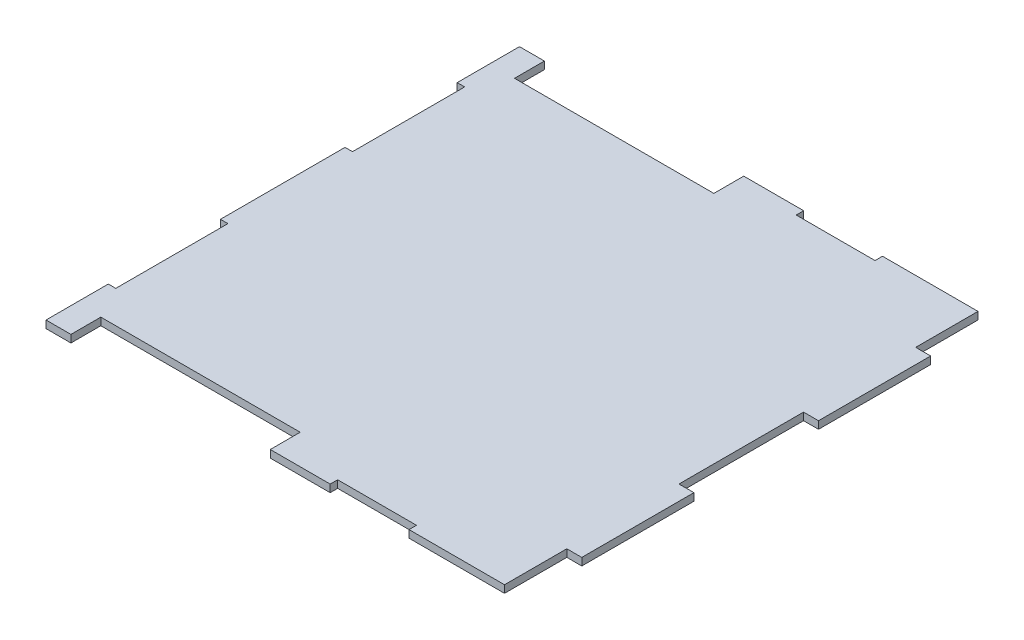
ISO-10303-21;
HEADER;
FILE_DESCRIPTION(('STEP AP214'),'2;1');
FILE_NAME('part.step','',(''),(''),'','','');
FILE_SCHEMA(('AUTOMOTIVE_DESIGN { 1 0 10303 214 1 1 1 1 }'));
ENDSEC;
DATA;
#1=APPLICATION_CONTEXT('core data for automotive mechanical design processes');
#2=APPLICATION_PROTOCOL_DEFINITION('international standard','automotive_design',2000,#1);
#3=PRODUCT_CONTEXT('',#1,'mechanical');
#4=PRODUCT('Part','Part','',(#3));
#5=PRODUCT_RELATED_PRODUCT_CATEGORY('part','',(#4));
#6=PRODUCT_DEFINITION_FORMATION('','',#4);
#7=PRODUCT_DEFINITION_CONTEXT('part definition',#1,'design');
#8=PRODUCT_DEFINITION('design','',#6,#7);
#9=PRODUCT_DEFINITION_SHAPE('','',#8);
#10=(LENGTH_UNIT() NAMED_UNIT(*) SI_UNIT(.MILLI.,.METRE.));
#11=(NAMED_UNIT(*) PLANE_ANGLE_UNIT() SI_UNIT($,.RADIAN.));
#12=(NAMED_UNIT(*) SI_UNIT($,.STERADIAN.) SOLID_ANGLE_UNIT());
#13=UNCERTAINTY_MEASURE_WITH_UNIT(LENGTH_MEASURE(1.E-05),#10,'distance_accuracy_value','');
#14=(GEOMETRIC_REPRESENTATION_CONTEXT(3) GLOBAL_UNCERTAINTY_ASSIGNED_CONTEXT((#13)) GLOBAL_UNIT_ASSIGNED_CONTEXT((#10,
#11,#12)) REPRESENTATION_CONTEXT('',''));
#15=CARTESIAN_POINT('',(0.,0.,0.));
#16=DIRECTION('',(0.,0.,1.));
#17=DIRECTION('',(1.,0.,0.));
#18=AXIS2_PLACEMENT_3D('',#15,#16,#17);
#19=CARTESIAN_POINT('',(-95.0000000000003,3.,-95.));
#20=DIRECTION('',(0.,0.,1.));
#21=DIRECTION('',(1.,0.,0.));
#22=AXIS2_PLACEMENT_3D('',#19,#20,#21);
#23=PLANE('',#22);
#24=DIRECTION('',(0.,-1.,0.));
#25=VECTOR('',#24,1.);
#26=CARTESIAN_POINT('',(19.0397321414941,0.,-95.0000000000001));
#27=LINE('',#26,#25);
#28=CARTESIAN_POINT('',(19.0397321414941,3.,-95.0000000000001));
#29=VERTEX_POINT('',#28);
#30=CARTESIAN_POINT('',(19.0397321414941,0.,-95.0000000000001));
#31=VERTEX_POINT('',#30);
#32=EDGE_CURVE('E284',#29,#31,#27,.T.);
#33=ORIENTED_EDGE('',*,*,#32,.T.);
#34=DIRECTION('',(-1.,0.,0.));
#35=VECTOR('',#34,1.);
#36=CARTESIAN_POINT('',(-95.0000000000003,0.,-95.));
#37=LINE('',#36,#35);
#38=CARTESIAN_POINT('',(-5.00000000000032,0.,-95.));
#39=VERTEX_POINT('',#38);
#40=EDGE_CURVE('E513',#31,#39,#37,.T.);
#41=ORIENTED_EDGE('',*,*,#40,.T.);
#42=DIRECTION('',(0.,1.,0.));
#43=VECTOR('',#42,1.);
#44=CARTESIAN_POINT('',(-5.00000000000032,0.,-95.));
#45=LINE('',#44,#43);
#46=CARTESIAN_POINT('',(-5.00000000000032,3.,-95.));
#47=VERTEX_POINT('',#46);
#48=EDGE_CURVE('E331',#39,#47,#45,.T.);
#49=ORIENTED_EDGE('',*,*,#48,.T.);
#50=DIRECTION('',(-1.,0.,0.));
#51=VECTOR('',#50,1.);
#52=CARTESIAN_POINT('',(-95.0000000000003,3.,-95.));
#53=LINE('',#52,#51);
#54=EDGE_CURVE('E495',#29,#47,#53,.T.);
#55=ORIENTED_EDGE('',*,*,#54,.F.);
#56=EDGE_LOOP('',(#33,#41,#49,#55));
#57=FACE_BOUND('',#56,.T.);
#58=ADVANCED_FACE('F36',(#57),#23,.F.);
#59=DIRECTION('',(-0.00484443285385107,0.999988265666315,0.));
#60=VECTOR('',#59,1.);
#61=CARTESIAN_POINT('',(50.6784146236668,3.,-95.0000000000001));
#62=LINE('',#61,#60);
#63=CARTESIAN_POINT('',(50.6929480927689,0.,-95.0000000000001));
#64=VERTEX_POINT('',#63);
#65=CARTESIAN_POINT('',(50.6784146236668,3.,-95.0000000000001));
#66=VERTEX_POINT('',#65);
#67=EDGE_CURVE('E589',#64,#66,#62,.T.);
#68=ORIENTED_EDGE('',*,*,#67,.T.);
#69=CARTESIAN_POINT('',(88.9999999999997,3.,-95.0000000000001));
#70=VERTEX_POINT('',#69);
#71=EDGE_CURVE('E290',#70,#66,#53,.T.);
#72=ORIENTED_EDGE('',*,*,#71,.F.);
#73=DIRECTION('',(0.,-1.,0.));
#74=VECTOR('',#73,1.);
#75=CARTESIAN_POINT('',(88.9999999999997,3.000012,-95.0000000000001));
#76=LINE('',#75,#74);
#77=CARTESIAN_POINT('',(88.9999999999997,0.,-95.0000000000001));
#78=VERTEX_POINT('',#77);
#79=EDGE_CURVE('E422',#70,#78,#76,.T.);
#80=ORIENTED_EDGE('',*,*,#79,.T.);
#81=EDGE_CURVE('E509',#78,#64,#37,.T.);
#82=ORIENTED_EDGE('',*,*,#81,.T.);
#83=EDGE_LOOP('',(#68,#72,#80,#82));
#84=FACE_BOUND('',#83,.T.);
#85=ADVANCED_FACE('F573',(#84),#23,.F.);
#86=CARTESIAN_POINT('',(0.,3.,0.));
#87=DIRECTION('',(0.,-1.,0.));
#88=DIRECTION('',(0.,0.,-1.));
#89=AXIS2_PLACEMENT_3D('',#86,#87,#88);
#90=PLANE('',#89);
#91=DIRECTION('',(0.,0.,-1.));
#92=VECTOR('',#91,1.);
#93=CARTESIAN_POINT('',(19.0397321414941,3.,-92.0000000000001));
#94=LINE('',#93,#92);
#95=CARTESIAN_POINT('',(19.0397321414941,3.,-92.0000000000001));
#96=VERTEX_POINT('',#95);
#97=EDGE_CURVE('E309',#96,#29,#94,.T.);
#98=ORIENTED_EDGE('',*,*,#97,.T.);
#99=ORIENTED_EDGE('',*,*,#54,.T.);
#100=DIRECTION('',(0.,0.,-1.));
#101=VECTOR('',#100,1.);
#102=CARTESIAN_POINT('',(-5.00000000000032,3.,-83.));
#103=LINE('',#102,#101);
#104=CARTESIAN_POINT('',(-5.00000000000032,3.,-83.));
#105=VERTEX_POINT('',#104);
#106=EDGE_CURVE('E332',#105,#47,#103,.T.);
#107=ORIENTED_EDGE('',*,*,#106,.F.);
#108=DIRECTION('',(1.,0.,0.));
#109=VECTOR('',#108,1.);
#110=CARTESIAN_POINT('',(-85.0000000000003,3.,-83.));
#111=LINE('',#110,#109);
#112=CARTESIAN_POINT('',(-85.0000000000003,3.,-83.));
#113=VERTEX_POINT('',#112);
#114=EDGE_CURVE('E325',#113,#105,#111,.T.);
#115=ORIENTED_EDGE('',*,*,#114,.F.);
#116=DIRECTION('',(0.,0.,1.));
#117=VECTOR('',#116,1.);
#118=CARTESIAN_POINT('',(-85.0000000000003,3.,-83.));
#119=LINE('',#118,#117);
#120=CARTESIAN_POINT('',(-85.0000000000003,3.,-95.));
#121=VERTEX_POINT('',#120);
#122=EDGE_CURVE('E335',#121,#113,#119,.T.);
#123=ORIENTED_EDGE('',*,*,#122,.F.);
#124=CARTESIAN_POINT('',(-95.0000000000003,3.,-95.));
#125=VERTEX_POINT('',#124);
#126=EDGE_CURVE('E496',#121,#125,#53,.T.);
#127=ORIENTED_EDGE('',*,*,#126,.T.);
#128=DIRECTION('',(0.,0.,1.));
#129=VECTOR('',#128,1.);
#130=CARTESIAN_POINT('',(-95.0000000000003,3.,95.0000000000001));
#131=LINE('',#130,#129);
#132=CARTESIAN_POINT('',(-95.0000000000003,3.,-70.0000000000001));
#133=VERTEX_POINT('',#132);
#134=EDGE_CURVE('E497',#125,#133,#131,.T.);
#135=ORIENTED_EDGE('',*,*,#134,.T.);
#136=DIRECTION('',(1.,0.,0.));
#137=VECTOR('',#136,1.);
#138=CARTESIAN_POINT('',(0.,3.,-70.0000000000001));
#139=LINE('',#138,#137);
#140=CARTESIAN_POINT('',(-92.0000000000003,3.,-70.0000000000001));
#141=VERTEX_POINT('',#140);
#142=EDGE_CURVE('E464',#133,#141,#139,.T.);
#143=ORIENTED_EDGE('',*,*,#142,.T.);
#144=DIRECTION('',(0.,0.,1.));
#145=VECTOR('',#144,1.);
#146=CARTESIAN_POINT('',(-92.0000000000003,3.,0.));
#147=LINE('',#146,#145);
#148=CARTESIAN_POINT('',(-92.0000000000003,3.,-25.));
#149=VERTEX_POINT('',#148);
#150=EDGE_CURVE('E461',#141,#149,#147,.T.);
#151=ORIENTED_EDGE('',*,*,#150,.T.);
#152=DIRECTION('',(-1.,0.,0.));
#153=VECTOR('',#152,1.);
#154=CARTESIAN_POINT('',(0.,3.,-25.));
#155=LINE('',#154,#153);
#156=CARTESIAN_POINT('',(-95.0000000000003,3.,-25.));
#157=VERTEX_POINT('',#156);
#158=EDGE_CURVE('E458',#149,#157,#155,.T.);
#159=ORIENTED_EDGE('',*,*,#158,.T.);
#160=CARTESIAN_POINT('',(-95.0000000000003,3.,25.));
#161=VERTEX_POINT('',#160);
#162=EDGE_CURVE('E501',#157,#161,#131,.T.);
#163=ORIENTED_EDGE('',*,*,#162,.T.);
#164=DIRECTION('',(1.,0.,0.));
#165=VECTOR('',#164,1.);
#166=CARTESIAN_POINT('',(0.,3.,25.));
#167=LINE('',#166,#165);
#168=CARTESIAN_POINT('',(-92.0000000000003,3.,25.));
#169=VERTEX_POINT('',#168);
#170=EDGE_CURVE('E455',#161,#169,#167,.T.);
#171=ORIENTED_EDGE('',*,*,#170,.T.);
#172=DIRECTION('',(0.,0.,1.));
#173=VECTOR('',#172,1.);
#174=CARTESIAN_POINT('',(-92.0000000000003,3.,0.));
#175=LINE('',#174,#173);
#176=CARTESIAN_POINT('',(-92.0000000000003,3.,70.0000000000001));
#177=VERTEX_POINT('',#176);
#178=EDGE_CURVE('E452',#169,#177,#175,.T.);
#179=ORIENTED_EDGE('',*,*,#178,.T.);
#180=DIRECTION('',(-1.,0.,0.));
#181=VECTOR('',#180,1.);
#182=CARTESIAN_POINT('',(0.,3.,70.0000000000001));
#183=LINE('',#182,#181);
#184=CARTESIAN_POINT('',(-95.0000000000003,3.,70.0000000000001));
#185=VERTEX_POINT('',#184);
#186=EDGE_CURVE('E449',#177,#185,#183,.T.);
#187=ORIENTED_EDGE('',*,*,#186,.T.);
#188=CARTESIAN_POINT('',(-95.0000000000003,3.,95.0000000000001));
#189=VERTEX_POINT('',#188);
#190=EDGE_CURVE('E494',#185,#189,#131,.T.);
#191=ORIENTED_EDGE('',*,*,#190,.T.);
#192=DIRECTION('',(1.,0.,0.));
#193=VECTOR('',#192,1.);
#194=CARTESIAN_POINT('',(-95.0000000000003,3.,95.0000000000001));
#195=LINE('',#194,#193);
#196=CARTESIAN_POINT('',(-85.0000000000003,3.,95.));
#197=VERTEX_POINT('',#196);
#198=EDGE_CURVE('E502',#189,#197,#195,.T.);
#199=ORIENTED_EDGE('',*,*,#198,.T.);
#200=DIRECTION('',(0.,0.,1.));
#201=VECTOR('',#200,1.);
#202=CARTESIAN_POINT('',(-85.0000000000003,3.,83.));
#203=LINE('',#202,#201);
#204=CARTESIAN_POINT('',(-85.0000000000003,3.,83.));
#205=VERTEX_POINT('',#204);
#206=EDGE_CURVE('E314',#205,#197,#203,.T.);
#207=ORIENTED_EDGE('',*,*,#206,.F.);
#208=DIRECTION('',(-1.,0.,0.));
#209=VECTOR('',#208,1.);
#210=CARTESIAN_POINT('',(-85.0000000000003,3.,83.));
#211=LINE('',#210,#209);
#212=CARTESIAN_POINT('',(-5.00000000000032,3.,83.));
#213=VERTEX_POINT('',#212);
#214=EDGE_CURVE('E354',#213,#205,#211,.T.);
#215=ORIENTED_EDGE('',*,*,#214,.F.);
#216=DIRECTION('',(0.,0.,-1.));
#217=VECTOR('',#216,1.);
#218=CARTESIAN_POINT('',(-5.00000000000032,3.,83.));
#219=LINE('',#218,#217);
#220=CARTESIAN_POINT('',(-5.00000000000032,3.,95.));
#221=VERTEX_POINT('',#220);
#222=EDGE_CURVE('E362',#221,#213,#219,.T.);
#223=ORIENTED_EDGE('',*,*,#222,.F.);
#224=CARTESIAN_POINT('',(19.0397321414941,3.,95.0000000000001));
#225=VERTEX_POINT('',#224);
#226=EDGE_CURVE('E505',#221,#225,#195,.T.);
#227=ORIENTED_EDGE('',*,*,#226,.T.);
#228=DIRECTION('',(0.,0.,1.));
#229=VECTOR('',#228,1.);
#230=CARTESIAN_POINT('',(19.0397321414941,3.,92.0000000000001));
#231=LINE('',#230,#229);
#232=CARTESIAN_POINT('',(19.0397321414941,3.,92.0000000000001));
#233=VERTEX_POINT('',#232);
#234=EDGE_CURVE('E306',#233,#225,#231,.T.);
#235=ORIENTED_EDGE('',*,*,#234,.F.);
#236=DIRECTION('',(-1.,0.,0.));
#237=VECTOR('',#236,1.);
#238=CARTESIAN_POINT('',(19.0397321414941,3.,92.0000000000001));
#239=LINE('',#238,#237);
#240=CARTESIAN_POINT('',(50.6784146236668,3.,92.0000000000001));
#241=VERTEX_POINT('',#240);
#242=EDGE_CURVE('E297',#241,#233,#239,.T.);
#243=ORIENTED_EDGE('',*,*,#242,.F.);
#244=DIRECTION('',(0.,0.,1.));
#245=VECTOR('',#244,1.);
#246=CARTESIAN_POINT('',(50.6784146236668,3.,92.0000000000001));
#247=LINE('',#246,#245);
#248=CARTESIAN_POINT('',(50.6784146236668,3.,95.0000000000001));
#249=VERTEX_POINT('',#248);
#250=EDGE_CURVE('E311',#241,#249,#247,.T.);
#251=ORIENTED_EDGE('',*,*,#250,.T.);
#252=CARTESIAN_POINT('',(88.9999999999997,3.,95.0000000000001));
#253=VERTEX_POINT('',#252);
#254=EDGE_CURVE('E500',#249,#253,#195,.T.);
#255=ORIENTED_EDGE('',*,*,#254,.T.);
#256=DIRECTION('',(0.,0.,-1.));
#257=VECTOR('',#256,1.);
#258=CARTESIAN_POINT('',(88.9999999999997,3.,0.));
#259=LINE('',#258,#257);
#260=CARTESIAN_POINT('',(88.9999999999997,3.,70.0000000000001));
#261=VERTEX_POINT('',#260);
#262=EDGE_CURVE('E484',#253,#261,#259,.T.);
#263=ORIENTED_EDGE('',*,*,#262,.T.);
#264=DIRECTION('',(1.,0.,0.));
#265=VECTOR('',#264,1.);
#266=CARTESIAN_POINT('',(0.,3.,70.0000000000001));
#267=LINE('',#266,#265);
#268=CARTESIAN_POINT('',(94.9999999999997,3.,70.0000000000001));
#269=VERTEX_POINT('',#268);
#270=EDGE_CURVE('E481',#261,#269,#267,.T.);
#271=ORIENTED_EDGE('',*,*,#270,.T.);
#272=DIRECTION('',(0.,0.,-1.));
#273=VECTOR('',#272,1.);
#274=CARTESIAN_POINT('',(94.9999999999997,3.,95.0000000000001));
#275=LINE('',#274,#273);
#276=CARTESIAN_POINT('',(94.9999999999997,3.,25.));
#277=VERTEX_POINT('',#276);
#278=EDGE_CURVE('E491',#269,#277,#275,.T.);
#279=ORIENTED_EDGE('',*,*,#278,.T.);
#280=DIRECTION('',(-1.,0.,0.));
#281=VECTOR('',#280,1.);
#282=CARTESIAN_POINT('',(0.,3.,25.0000000000001));
#283=LINE('',#282,#281);
#284=CARTESIAN_POINT('',(88.9999999999997,3.,25.));
#285=VERTEX_POINT('',#284);
#286=EDGE_CURVE('E478',#277,#285,#283,.T.);
#287=ORIENTED_EDGE('',*,*,#286,.T.);
#288=DIRECTION('',(0.,0.,-1.));
#289=VECTOR('',#288,1.);
#290=CARTESIAN_POINT('',(88.9999999999997,3.,0.));
#291=LINE('',#290,#289);
#292=CARTESIAN_POINT('',(88.9999999999997,3.,-25.));
#293=VERTEX_POINT('',#292);
#294=EDGE_CURVE('E475',#285,#293,#291,.T.);
#295=ORIENTED_EDGE('',*,*,#294,.T.);
#296=DIRECTION('',(1.,0.,0.));
#297=VECTOR('',#296,1.);
#298=CARTESIAN_POINT('',(0.,3.,-25.));
#299=LINE('',#298,#297);
#300=CARTESIAN_POINT('',(94.9999999999997,3.,-25.));
#301=VERTEX_POINT('',#300);
#302=EDGE_CURVE('E472',#293,#301,#299,.T.);
#303=ORIENTED_EDGE('',*,*,#302,.T.);
#304=CARTESIAN_POINT('',(94.9999999999997,3.,-70.0000000000001));
#305=VERTEX_POINT('',#304);
#306=EDGE_CURVE('E488',#301,#305,#275,.T.);
#307=ORIENTED_EDGE('',*,*,#306,.T.);
#308=DIRECTION('',(-1.,0.,0.));
#309=VECTOR('',#308,1.);
#310=CARTESIAN_POINT('',(0.,3.,-70.0000000000001));
#311=LINE('',#310,#309);
#312=CARTESIAN_POINT('',(88.9999999999997,3.,-70.0000000000001));
#313=VERTEX_POINT('',#312);
#314=EDGE_CURVE('E469',#305,#313,#311,.T.);
#315=ORIENTED_EDGE('',*,*,#314,.T.);
#316=DIRECTION('',(0.,0.,-1.));
#317=VECTOR('',#316,1.);
#318=CARTESIAN_POINT('',(88.9999999999997,3.,0.));
#319=LINE('',#318,#317);
#320=EDGE_CURVE('E467',#313,#70,#319,.T.);
#321=ORIENTED_EDGE('',*,*,#320,.T.);
#322=ORIENTED_EDGE('',*,*,#71,.T.);
#323=DIRECTION('',(0.,0.,-1.));
#324=VECTOR('',#323,1.);
#325=CARTESIAN_POINT('',(50.6784146236668,3.,-92.0000000000001));
#326=LINE('',#325,#324);
#327=CARTESIAN_POINT('',(50.6784146236668,3.,-92.0000000000001));
#328=VERTEX_POINT('',#327);
#329=EDGE_CURVE('E270',#328,#66,#326,.T.);
#330=ORIENTED_EDGE('',*,*,#329,.F.);
#331=DIRECTION('',(-1.,0.,0.));
#332=VECTOR('',#331,1.);
#333=CARTESIAN_POINT('',(19.0397321414941,3.,-92.0000000000001));
#334=LINE('',#333,#332);
#335=EDGE_CURVE('E276',#328,#96,#334,.T.);
#336=ORIENTED_EDGE('',*,*,#335,.T.);
#337=EDGE_LOOP('',(#98,#99,#107,#115,#123,#127,#135,#143,#151,#159,#163,#171,#179,#187,#191,
#199,#207,#215,#223,#227,#235,#243,#251,#255,#263,#271,#279,#287,#295,#303,#307,#315,#321,#322,
#330,#336));
#338=FACE_BOUND('',#337,.T.);
#339=ADVANCED_FACE('F287',(#338),#90,.F.);
#340=CARTESIAN_POINT('',(0.,0.,0.));
#341=DIRECTION('',(0.,-1.,0.));
#342=DIRECTION('',(0.,0.,-1.));
#343=AXIS2_PLACEMENT_3D('',#340,#341,#342);
#344=PLANE('',#343);
#345=ORIENTED_EDGE('',*,*,#40,.F.);
#346=DIRECTION('',(0.,0.,-1.));
#347=VECTOR('',#346,1.);
#348=CARTESIAN_POINT('',(19.0397321414941,0.,-92.0000000000001));
#349=LINE('',#348,#347);
#350=CARTESIAN_POINT('',(19.0397321414941,0.,-92.0000000000001));
#351=VERTEX_POINT('',#350);
#352=EDGE_CURVE('E292',#351,#31,#349,.T.);
#353=ORIENTED_EDGE('',*,*,#352,.F.);
#354=DIRECTION('',(1.,0.,0.));
#355=VECTOR('',#354,1.);
#356=CARTESIAN_POINT('',(50.6929480927689,0.,-92.0000000000001));
#357=LINE('',#356,#355);
#358=CARTESIAN_POINT('',(50.6929480927689,0.,-92.0000000000001));
#359=VERTEX_POINT('',#358);
#360=EDGE_CURVE('E275',#351,#359,#357,.T.);
#361=ORIENTED_EDGE('',*,*,#360,.T.);
#362=DIRECTION('',(0.,0.,-1.));
#363=VECTOR('',#362,1.);
#364=CARTESIAN_POINT('',(50.6929480927689,0.,-92.0000000000001));
#365=LINE('',#364,#363);
#366=EDGE_CURVE('E273',#359,#64,#365,.T.);
#367=ORIENTED_EDGE('',*,*,#366,.T.);
#368=ORIENTED_EDGE('',*,*,#81,.F.);
#369=DIRECTION('',(0.,0.,-1.));
#370=VECTOR('',#369,1.);
#371=CARTESIAN_POINT('',(88.9999999999997,0.,-95.0000000000001));
#372=LINE('',#371,#370);
#373=CARTESIAN_POINT('',(88.9999999999997,0.,-70.0000000000001));
#374=VERTEX_POINT('',#373);
#375=EDGE_CURVE('E386',#374,#78,#372,.T.);
#376=ORIENTED_EDGE('',*,*,#375,.F.);
#377=DIRECTION('',(-1.,0.,0.));
#378=VECTOR('',#377,1.);
#379=CARTESIAN_POINT('',(88.9999999999997,0.,-70.0000000000001));
#380=LINE('',#379,#378);
#381=CARTESIAN_POINT('',(94.9999999999997,0.,-70.0000000000001));
#382=VERTEX_POINT('',#381);
#383=EDGE_CURVE('E384',#382,#374,#380,.T.);
#384=ORIENTED_EDGE('',*,*,#383,.F.);
#385=DIRECTION('',(0.,0.,-1.));
#386=VECTOR('',#385,1.);
#387=CARTESIAN_POINT('',(94.9999999999997,0.,95.0000000000001));
#388=LINE('',#387,#386);
#389=CARTESIAN_POINT('',(94.9999999999997,0.,-25.));
#390=VERTEX_POINT('',#389);
#391=EDGE_CURVE('E487',#390,#382,#388,.T.);
#392=ORIENTED_EDGE('',*,*,#391,.F.);
#393=DIRECTION('',(1.,0.,0.));
#394=VECTOR('',#393,1.);
#395=CARTESIAN_POINT('',(94.9999999999997,0.,-25.));
#396=LINE('',#395,#394);
#397=CARTESIAN_POINT('',(88.9999999999997,0.,-25.));
#398=VERTEX_POINT('',#397);
#399=EDGE_CURVE('E382',#398,#390,#396,.T.);
#400=ORIENTED_EDGE('',*,*,#399,.F.);
#401=DIRECTION('',(0.,0.,-1.));
#402=VECTOR('',#401,1.);
#403=CARTESIAN_POINT('',(88.9999999999997,0.,-25.));
#404=LINE('',#403,#402);
#405=CARTESIAN_POINT('',(88.9999999999997,0.,25.));
#406=VERTEX_POINT('',#405);
#407=EDGE_CURVE('E380',#406,#398,#404,.T.);
#408=ORIENTED_EDGE('',*,*,#407,.F.);
#409=DIRECTION('',(-1.,0.,0.));
#410=VECTOR('',#409,1.);
#411=CARTESIAN_POINT('',(88.9999999999997,0.,25.));
#412=LINE('',#411,#410);
#413=CARTESIAN_POINT('',(94.9999999999997,0.,25.));
#414=VERTEX_POINT('',#413);
#415=EDGE_CURVE('E377',#414,#406,#412,.T.);
#416=ORIENTED_EDGE('',*,*,#415,.F.);
#417=CARTESIAN_POINT('',(94.9999999999997,0.,70.0000000000001));
#418=VERTEX_POINT('',#417);
#419=EDGE_CURVE('E508',#418,#414,#388,.T.);
#420=ORIENTED_EDGE('',*,*,#419,.F.);
#421=DIRECTION('',(1.,0.,0.));
#422=VECTOR('',#421,1.);
#423=CARTESIAN_POINT('',(94.9999999999997,0.,70.0000000000001));
#424=LINE('',#423,#422);
#425=CARTESIAN_POINT('',(88.9999999999997,0.,70.0000000000001));
#426=VERTEX_POINT('',#425);
#427=EDGE_CURVE('E375',#426,#418,#424,.T.);
#428=ORIENTED_EDGE('',*,*,#427,.F.);
#429=DIRECTION('',(0.,0.,-1.));
#430=VECTOR('',#429,1.);
#431=CARTESIAN_POINT('',(88.9999999999997,0.,70.0000000000001));
#432=LINE('',#431,#430);
#433=CARTESIAN_POINT('',(88.9999999999997,0.,95.0000000000001));
#434=VERTEX_POINT('',#433);
#435=EDGE_CURVE('E343',#434,#426,#432,.T.);
#436=ORIENTED_EDGE('',*,*,#435,.F.);
#437=DIRECTION('',(1.,0.,0.));
#438=VECTOR('',#437,1.);
#439=CARTESIAN_POINT('',(-95.0000000000003,0.,95.0000000000001));
#440=LINE('',#439,#438);
#441=CARTESIAN_POINT('',(50.6929480927689,0.,95.0000000000001));
#442=VERTEX_POINT('',#441);
#443=EDGE_CURVE('E518',#442,#434,#440,.T.);
#444=ORIENTED_EDGE('',*,*,#443,.F.);
#445=DIRECTION('',(0.,0.,1.));
#446=VECTOR('',#445,1.);
#447=CARTESIAN_POINT('',(50.6929480927689,0.,92.0000000000001));
#448=LINE('',#447,#446);
#449=CARTESIAN_POINT('',(50.6929480927689,0.,92.0000000000001));
#450=VERTEX_POINT('',#449);
#451=EDGE_CURVE('E315',#450,#442,#448,.T.);
#452=ORIENTED_EDGE('',*,*,#451,.F.);
#453=DIRECTION('',(1.,0.,0.));
#454=VECTOR('',#453,1.);
#455=CARTESIAN_POINT('',(50.6929480927689,0.,92.0000000000001));
#456=LINE('',#455,#454);
#457=CARTESIAN_POINT('',(19.0397321414941,0.,92.0000000000001));
#458=VERTEX_POINT('',#457);
#459=EDGE_CURVE('E301',#458,#450,#456,.T.);
#460=ORIENTED_EDGE('',*,*,#459,.F.);
#461=DIRECTION('',(0.,0.,1.));
#462=VECTOR('',#461,1.);
#463=CARTESIAN_POINT('',(19.0397321414941,0.,92.0000000000001));
#464=LINE('',#463,#462);
#465=CARTESIAN_POINT('',(19.0397321414941,0.,95.0000000000001));
#466=VERTEX_POINT('',#465);
#467=EDGE_CURVE('E317',#458,#466,#464,.T.);
#468=ORIENTED_EDGE('',*,*,#467,.T.);
#469=CARTESIAN_POINT('',(-5.00000000000032,0.,95.));
#470=VERTEX_POINT('',#469);
#471=EDGE_CURVE('E521',#470,#466,#440,.T.);
#472=ORIENTED_EDGE('',*,*,#471,.F.);
#473=DIRECTION('',(0.,0.,-1.));
#474=VECTOR('',#473,1.);
#475=CARTESIAN_POINT('',(-5.00000000000032,0.,83.));
#476=LINE('',#475,#474);
#477=CARTESIAN_POINT('',(-5.00000000000032,0.,83.));
#478=VERTEX_POINT('',#477);
#479=EDGE_CURVE('E353',#470,#478,#476,.T.);
#480=ORIENTED_EDGE('',*,*,#479,.T.);
#481=DIRECTION('',(-1.,0.,0.));
#482=VECTOR('',#481,1.);
#483=CARTESIAN_POINT('',(-85.0000000000003,0.,83.));
#484=LINE('',#483,#482);
#485=CARTESIAN_POINT('',(-85.0000000000003,0.,83.));
#486=VERTEX_POINT('',#485);
#487=EDGE_CURVE('E357',#478,#486,#484,.T.);
#488=ORIENTED_EDGE('',*,*,#487,.T.);
#489=DIRECTION('',(0.,0.,1.));
#490=VECTOR('',#489,1.);
#491=CARTESIAN_POINT('',(-85.0000000000003,0.,83.));
#492=LINE('',#491,#490);
#493=CARTESIAN_POINT('',(-85.0000000000003,0.,95.));
#494=VERTEX_POINT('',#493);
#495=EDGE_CURVE('E350',#486,#494,#492,.T.);
#496=ORIENTED_EDGE('',*,*,#495,.T.);
#497=CARTESIAN_POINT('',(-95.0000000000003,0.,95.0000000000001));
#498=VERTEX_POINT('',#497);
#499=EDGE_CURVE('E492',#498,#494,#440,.T.);
#500=ORIENTED_EDGE('',*,*,#499,.F.);
#501=DIRECTION('',(0.,0.,1.));
#502=VECTOR('',#501,1.);
#503=CARTESIAN_POINT('',(-95.0000000000003,0.,95.0000000000001));
#504=LINE('',#503,#502);
#505=CARTESIAN_POINT('',(-95.0000000000003,0.,70.0000000000001));
#506=VERTEX_POINT('',#505);
#507=EDGE_CURVE('E512',#506,#498,#504,.T.);
#508=ORIENTED_EDGE('',*,*,#507,.F.);
#509=DIRECTION('',(-1.,0.,0.));
#510=VECTOR('',#509,1.);
#511=CARTESIAN_POINT('',(-95.0000000000003,0.,70.0000000000001));
#512=LINE('',#511,#510);
#513=CARTESIAN_POINT('',(-92.0000000000003,0.,70.0000000000001));
#514=VERTEX_POINT('',#513);
#515=EDGE_CURVE('E400',#514,#506,#512,.T.);
#516=ORIENTED_EDGE('',*,*,#515,.F.);
#517=DIRECTION('',(0.,0.,1.));
#518=VECTOR('',#517,1.);
#519=CARTESIAN_POINT('',(-92.0000000000003,0.,70.0000000000001));
#520=LINE('',#519,#518);
#521=CARTESIAN_POINT('',(-92.0000000000003,0.,25.));
#522=VERTEX_POINT('',#521);
#523=EDGE_CURVE('E398',#522,#514,#520,.T.);
#524=ORIENTED_EDGE('',*,*,#523,.F.);
#525=DIRECTION('',(1.,0.,0.));
#526=VECTOR('',#525,1.);
#527=CARTESIAN_POINT('',(-92.0000000000003,0.,25.));
#528=LINE('',#527,#526);
#529=CARTESIAN_POINT('',(-95.0000000000003,0.,25.));
#530=VERTEX_POINT('',#529);
#531=EDGE_CURVE('E395',#530,#522,#528,.T.);
#532=ORIENTED_EDGE('',*,*,#531,.F.);
#533=CARTESIAN_POINT('',(-95.0000000000003,0.,-25.));
#534=VERTEX_POINT('',#533);
#535=EDGE_CURVE('E519',#534,#530,#504,.T.);
#536=ORIENTED_EDGE('',*,*,#535,.F.);
#537=DIRECTION('',(-1.,0.,0.));
#538=VECTOR('',#537,1.);
#539=CARTESIAN_POINT('',(-92.0000000000003,0.,-25.));
#540=LINE('',#539,#538);
#541=CARTESIAN_POINT('',(-92.0000000000003,0.,-25.));
#542=VERTEX_POINT('',#541);
#543=EDGE_CURVE('E393',#542,#534,#540,.T.);
#544=ORIENTED_EDGE('',*,*,#543,.F.);
#545=DIRECTION('',(0.,0.,1.));
#546=VECTOR('',#545,1.);
#547=CARTESIAN_POINT('',(-92.0000000000003,0.,-70.0000000000001));
#548=LINE('',#547,#546);
#549=CARTESIAN_POINT('',(-92.0000000000003,0.,-70.0000000000001));
#550=VERTEX_POINT('',#549);
#551=EDGE_CURVE('E391',#550,#542,#548,.T.);
#552=ORIENTED_EDGE('',*,*,#551,.F.);
#553=DIRECTION('',(1.,0.,0.));
#554=VECTOR('',#553,1.);
#555=CARTESIAN_POINT('',(-95.0000000000003,0.,-70.0000000000001));
#556=LINE('',#555,#554);
#557=CARTESIAN_POINT('',(-95.0000000000003,0.,-70.0000000000001));
#558=VERTEX_POINT('',#557);
#559=EDGE_CURVE('E388',#558,#550,#556,.T.);
#560=ORIENTED_EDGE('',*,*,#559,.F.);
#561=CARTESIAN_POINT('',(-95.0000000000003,0.,-95.));
#562=VERTEX_POINT('',#561);
#563=EDGE_CURVE('E515',#562,#558,#504,.T.);
#564=ORIENTED_EDGE('',*,*,#563,.F.);
#565=CARTESIAN_POINT('',(-85.0000000000003,0.,-95.));
#566=VERTEX_POINT('',#565);
#567=EDGE_CURVE('E514',#566,#562,#37,.T.);
#568=ORIENTED_EDGE('',*,*,#567,.F.);
#569=DIRECTION('',(0.,0.,1.));
#570=VECTOR('',#569,1.);
#571=CARTESIAN_POINT('',(-85.0000000000003,0.,-83.));
#572=LINE('',#571,#570);
#573=CARTESIAN_POINT('',(-85.0000000000003,0.,-83.));
#574=VERTEX_POINT('',#573);
#575=EDGE_CURVE('E324',#566,#574,#572,.T.);
#576=ORIENTED_EDGE('',*,*,#575,.T.);
#577=DIRECTION('',(1.,0.,0.));
#578=VECTOR('',#577,1.);
#579=CARTESIAN_POINT('',(-85.0000000000003,0.,-83.));
#580=LINE('',#579,#578);
#581=CARTESIAN_POINT('',(-5.00000000000032,0.,-83.));
#582=VERTEX_POINT('',#581);
#583=EDGE_CURVE('E328',#574,#582,#580,.T.);
#584=ORIENTED_EDGE('',*,*,#583,.T.);
#585=DIRECTION('',(0.,0.,-1.));
#586=VECTOR('',#585,1.);
#587=CARTESIAN_POINT('',(-5.00000000000032,0.,-83.));
#588=LINE('',#587,#586);
#589=EDGE_CURVE('E321',#582,#39,#588,.T.);
#590=ORIENTED_EDGE('',*,*,#589,.T.);
#591=EDGE_LOOP('',(#345,#353,#361,#367,#368,#376,#384,#392,#400,#408,#416,#420,#428,#436,#444,
#452,#460,#468,#472,#480,#488,#496,#500,#508,#516,#524,#532,#536,#544,#552,#560,#564,#568,#576,
#584,#590));
#592=FACE_BOUND('',#591,.T.);
#593=ADVANCED_FACE('F533',(#592),#344,.T.);
#594=CARTESIAN_POINT('',(-95.0000000000003,3.,95.0000000000001));
#595=DIRECTION('',(0.,0.,-1.));
#596=DIRECTION('',(-1.,0.,0.));
#597=AXIS2_PLACEMENT_3D('',#594,#595,#596);
#598=PLANE('',#597);
#599=ORIENTED_EDGE('',*,*,#254,.F.);
#600=DIRECTION('',(-0.00484443285385107,0.999988265666315,0.));
#601=VECTOR('',#600,1.);
#602=CARTESIAN_POINT('',(50.6784146236668,3.,95.0000000000001));
#603=LINE('',#602,#601);
#604=EDGE_CURVE('E299',#442,#249,#603,.T.);
#605=ORIENTED_EDGE('',*,*,#604,.F.);
#606=ORIENTED_EDGE('',*,*,#443,.T.);
#607=DIRECTION('',(0.,-1.,0.));
#608=VECTOR('',#607,1.);
#609=CARTESIAN_POINT('',(88.9999999999997,3.000012,95.0000000000001));
#610=LINE('',#609,#608);
#611=EDGE_CURVE('E446',#253,#434,#610,.T.);
#612=ORIENTED_EDGE('',*,*,#611,.F.);
#613=EDGE_LOOP('',(#599,#605,#606,#612));
#614=FACE_BOUND('',#613,.T.);
#615=ADVANCED_FACE('F571',(#614),#598,.F.);
#616=ORIENTED_EDGE('',*,*,#499,.T.);
#617=DIRECTION('',(0.,1.,0.));
#618=VECTOR('',#617,1.);
#619=CARTESIAN_POINT('',(-85.0000000000003,0.,95.));
#620=LINE('',#619,#618);
#621=EDGE_CURVE('E360',#494,#197,#620,.T.);
#622=ORIENTED_EDGE('',*,*,#621,.T.);
#623=ORIENTED_EDGE('',*,*,#198,.F.);
#624=DIRECTION('',(0.,-1.,0.));
#625=VECTOR('',#624,1.);
#626=CARTESIAN_POINT('',(-95.0000000000003,3.,95.0000000000001));
#627=LINE('',#626,#625);
#628=EDGE_CURVE('E44',#189,#498,#627,.T.);
#629=ORIENTED_EDGE('',*,*,#628,.T.);
#630=EDGE_LOOP('',(#616,#622,#623,#629));
#631=FACE_BOUND('',#630,.T.);
#632=ADVANCED_FACE('F527',(#631),#598,.F.);
#633=CARTESIAN_POINT('',(94.9999999999997,3.,95.0000000000001));
#634=DIRECTION('',(-1.,0.,0.));
#635=DIRECTION('',(0.,0.,1.));
#636=AXIS2_PLACEMENT_3D('',#633,#634,#635);
#637=PLANE('',#636);
#638=ORIENTED_EDGE('',*,*,#278,.F.);
#639=DIRECTION('',(0.,-1.,0.));
#640=VECTOR('',#639,1.);
#641=CARTESIAN_POINT('',(94.9999999999997,3.000012,70.0000000000001));
#642=LINE('',#641,#640);
#643=EDGE_CURVE('E440',#269,#418,#642,.T.);
#644=ORIENTED_EDGE('',*,*,#643,.T.);
#645=ORIENTED_EDGE('',*,*,#419,.T.);
#646=DIRECTION('',(0.,-1.,0.));
#647=VECTOR('',#646,1.);
#648=CARTESIAN_POINT('',(94.9999999999997,3.000012,25.));
#649=LINE('',#648,#647);
#650=EDGE_CURVE('E438',#277,#414,#649,.T.);
#651=ORIENTED_EDGE('',*,*,#650,.F.);
#652=EDGE_LOOP('',(#638,#644,#645,#651));
#653=FACE_BOUND('',#652,.T.);
#654=ADVANCED_FACE('F575',(#653),#637,.F.);
#655=CARTESIAN_POINT('',(-95.0000000000003,3.,95.0000000000001));
#656=DIRECTION('',(1.,0.,0.));
#657=DIRECTION('',(0.,0.,-1.));
#658=AXIS2_PLACEMENT_3D('',#655,#656,#657);
#659=PLANE('',#658);
#660=ORIENTED_EDGE('',*,*,#563,.T.);
#661=DIRECTION('',(0.,-1.,0.));
#662=VECTOR('',#661,1.);
#663=CARTESIAN_POINT('',(-95.0000000000003,3.000012,-70.0000000000001));
#664=LINE('',#663,#662);
#665=EDGE_CURVE('E420',#133,#558,#664,.T.);
#666=ORIENTED_EDGE('',*,*,#665,.F.);
#667=ORIENTED_EDGE('',*,*,#134,.F.);
#668=DIRECTION('',(0.,-1.,0.));
#669=VECTOR('',#668,1.);
#670=CARTESIAN_POINT('',(-95.0000000000003,3.,-95.));
#671=LINE('',#670,#669);
#672=EDGE_CURVE('E12',#125,#562,#671,.T.);
#673=ORIENTED_EDGE('',*,*,#672,.T.);
#674=EDGE_LOOP('',(#660,#666,#667,#673));
#675=FACE_BOUND('',#674,.T.);
#676=ADVANCED_FACE('F563',(#675),#659,.F.);
#677=ORIENTED_EDGE('',*,*,#162,.F.);
#678=DIRECTION('',(0.,-1.,0.));
#679=VECTOR('',#678,1.);
#680=CARTESIAN_POINT('',(-95.0000000000003,3.000012,-25.));
#681=LINE('',#680,#679);
#682=EDGE_CURVE('E412',#157,#534,#681,.T.);
#683=ORIENTED_EDGE('',*,*,#682,.T.);
#684=ORIENTED_EDGE('',*,*,#535,.T.);
#685=DIRECTION('',(0.,-1.,0.));
#686=VECTOR('',#685,1.);
#687=CARTESIAN_POINT('',(-95.0000000000003,3.000012,25.));
#688=LINE('',#687,#686);
#689=EDGE_CURVE('E410',#161,#530,#688,.T.);
#690=ORIENTED_EDGE('',*,*,#689,.F.);
#691=EDGE_LOOP('',(#677,#683,#684,#690));
#692=FACE_BOUND('',#691,.T.);
#693=ADVANCED_FACE('F544',(#692),#659,.F.);
#694=ORIENTED_EDGE('',*,*,#306,.F.);
#695=DIRECTION('',(0.,-1.,0.));
#696=VECTOR('',#695,1.);
#697=CARTESIAN_POINT('',(94.9999999999997,3.000012,-25.));
#698=LINE('',#697,#696);
#699=EDGE_CURVE('E430',#301,#390,#698,.T.);
#700=ORIENTED_EDGE('',*,*,#699,.T.);
#701=ORIENTED_EDGE('',*,*,#391,.T.);
#702=DIRECTION('',(0.,-1.,0.));
#703=VECTOR('',#702,1.);
#704=CARTESIAN_POINT('',(94.9999999999997,3.000012,-70.0000000000001));
#705=LINE('',#704,#703);
#706=EDGE_CURVE('E428',#305,#382,#705,.T.);
#707=ORIENTED_EDGE('',*,*,#706,.F.);
#708=EDGE_LOOP('',(#694,#700,#701,#707));
#709=FACE_BOUND('',#708,.T.);
#710=ADVANCED_FACE('F38',(#709),#637,.F.);
#711=ORIENTED_EDGE('',*,*,#126,.F.);
#712=DIRECTION('',(0.,1.,0.));
#713=VECTOR('',#712,1.);
#714=CARTESIAN_POINT('',(-85.0000000000003,0.,-95.));
#715=LINE('',#714,#713);
#716=EDGE_CURVE('E346',#566,#121,#715,.T.);
#717=ORIENTED_EDGE('',*,*,#716,.F.);
#718=ORIENTED_EDGE('',*,*,#567,.T.);
#719=ORIENTED_EDGE('',*,*,#672,.F.);
#720=EDGE_LOOP('',(#711,#717,#718,#719));
#721=FACE_BOUND('',#720,.T.);
#722=ADVANCED_FACE('F561',(#721),#23,.F.);
#723=ORIENTED_EDGE('',*,*,#190,.F.);
#724=DIRECTION('',(0.,-1.,0.));
#725=VECTOR('',#724,1.);
#726=CARTESIAN_POINT('',(-95.0000000000003,3.000012,70.0000000000001));
#727=LINE('',#726,#725);
#728=EDGE_CURVE('E402',#185,#506,#727,.T.);
#729=ORIENTED_EDGE('',*,*,#728,.T.);
#730=ORIENTED_EDGE('',*,*,#507,.T.);
#731=ORIENTED_EDGE('',*,*,#628,.F.);
#732=EDGE_LOOP('',(#723,#729,#730,#731));
#733=FACE_BOUND('',#732,.T.);
#734=ADVANCED_FACE('F558',(#733),#659,.F.);
#735=ORIENTED_EDGE('',*,*,#471,.T.);
#736=DIRECTION('',(0.,-1.,0.));
#737=VECTOR('',#736,1.);
#738=CARTESIAN_POINT('',(19.0397321414941,0.,95.0000000000001));
#739=LINE('',#738,#737);
#740=EDGE_CURVE('E307',#225,#466,#739,.T.);
#741=ORIENTED_EDGE('',*,*,#740,.F.);
#742=ORIENTED_EDGE('',*,*,#226,.F.);
#743=DIRECTION('',(0.,1.,0.));
#744=VECTOR('',#743,1.);
#745=CARTESIAN_POINT('',(-5.00000000000032,0.,95.));
#746=LINE('',#745,#744);
#747=EDGE_CURVE('E370',#470,#221,#746,.T.);
#748=ORIENTED_EDGE('',*,*,#747,.F.);
#749=EDGE_LOOP('',(#735,#741,#742,#748));
#750=FACE_BOUND('',#749,.T.);
#751=ADVANCED_FACE('F560',(#750),#598,.F.);
#752=CARTESIAN_POINT('',(-95.0000000000003,3.000012,70.0000000000001));
#753=DIRECTION('',(0.,0.,1.));
#754=DIRECTION('',(1.,0.,0.));
#755=AXIS2_PLACEMENT_3D('',#752,#753,#754);
#756=PLANE('',#755);
#757=DIRECTION('',(0.,-1.,0.));
#758=VECTOR('',#757,1.);
#759=CARTESIAN_POINT('',(-92.0000000000003,3.000012,70.0000000000001));
#760=LINE('',#759,#758);
#761=EDGE_CURVE('E405',#177,#514,#760,.T.);
#762=ORIENTED_EDGE('',*,*,#761,.T.);
#763=ORIENTED_EDGE('',*,*,#515,.T.);
#764=ORIENTED_EDGE('',*,*,#728,.F.);
#765=ORIENTED_EDGE('',*,*,#186,.F.);
#766=EDGE_LOOP('',(#762,#763,#764,#765));
#767=FACE_BOUND('',#766,.T.);
#768=ADVANCED_FACE('F557',(#767),#756,.F.);
#769=CARTESIAN_POINT('',(-92.0000000000003,3.000012,70.0000000000001));
#770=DIRECTION('',(1.,0.,0.));
#771=DIRECTION('',(0.,0.,-1.));
#772=AXIS2_PLACEMENT_3D('',#769,#770,#771);
#773=PLANE('',#772);
#774=DIRECTION('',(0.,-1.,0.));
#775=VECTOR('',#774,1.);
#776=CARTESIAN_POINT('',(-92.0000000000003,3.000012,25.));
#777=LINE('',#776,#775);
#778=EDGE_CURVE('E408',#169,#522,#777,.T.);
#779=ORIENTED_EDGE('',*,*,#778,.T.);
#780=ORIENTED_EDGE('',*,*,#523,.T.);
#781=ORIENTED_EDGE('',*,*,#761,.F.);
#782=ORIENTED_EDGE('',*,*,#178,.F.);
#783=EDGE_LOOP('',(#779,#780,#781,#782));
#784=FACE_BOUND('',#783,.T.);
#785=ADVANCED_FACE('F555',(#784),#773,.F.);
#786=CARTESIAN_POINT('',(-92.0000000000003,3.000012,25.));
#787=DIRECTION('',(0.,0.,-1.));
#788=DIRECTION('',(-1.,0.,0.));
#789=AXIS2_PLACEMENT_3D('',#786,#787,#788);
#790=PLANE('',#789);
#791=ORIENTED_EDGE('',*,*,#689,.T.);
#792=ORIENTED_EDGE('',*,*,#531,.T.);
#793=ORIENTED_EDGE('',*,*,#778,.F.);
#794=ORIENTED_EDGE('',*,*,#170,.F.);
#795=EDGE_LOOP('',(#791,#792,#793,#794));
#796=FACE_BOUND('',#795,.T.);
#797=ADVANCED_FACE('F549',(#796),#790,.F.);
#798=CARTESIAN_POINT('',(-92.0000000000003,3.000012,-25.));
#799=DIRECTION('',(0.,0.,1.));
#800=DIRECTION('',(1.,0.,0.));
#801=AXIS2_PLACEMENT_3D('',#798,#799,#800);
#802=PLANE('',#801);
#803=DIRECTION('',(0.,-1.,0.));
#804=VECTOR('',#803,1.);
#805=CARTESIAN_POINT('',(-92.0000000000003,3.000012,-25.));
#806=LINE('',#805,#804);
#807=EDGE_CURVE('E415',#149,#542,#806,.T.);
#808=ORIENTED_EDGE('',*,*,#807,.T.);
#809=ORIENTED_EDGE('',*,*,#543,.T.);
#810=ORIENTED_EDGE('',*,*,#682,.F.);
#811=ORIENTED_EDGE('',*,*,#158,.F.);
#812=EDGE_LOOP('',(#808,#809,#810,#811));
#813=FACE_BOUND('',#812,.T.);
#814=ADVANCED_FACE('F632',(#813),#802,.F.);
#815=CARTESIAN_POINT('',(-92.0000000000003,3.000012,-70.0000000000001));
#816=DIRECTION('',(1.,0.,0.));
#817=DIRECTION('',(0.,0.,-1.));
#818=AXIS2_PLACEMENT_3D('',#815,#816,#817);
#819=PLANE('',#818);
#820=DIRECTION('',(0.,-1.,0.));
#821=VECTOR('',#820,1.);
#822=CARTESIAN_POINT('',(-92.0000000000003,3.000012,-70.0000000000001));
#823=LINE('',#822,#821);
#824=EDGE_CURVE('E418',#141,#550,#823,.T.);
#825=ORIENTED_EDGE('',*,*,#824,.T.);
#826=ORIENTED_EDGE('',*,*,#551,.T.);
#827=ORIENTED_EDGE('',*,*,#807,.F.);
#828=ORIENTED_EDGE('',*,*,#150,.F.);
#829=EDGE_LOOP('',(#825,#826,#827,#828));
#830=FACE_BOUND('',#829,.T.);
#831=ADVANCED_FACE('F629',(#830),#819,.F.);
#832=CARTESIAN_POINT('',(-95.0000000000003,3.000012,-70.0000000000001));
#833=DIRECTION('',(0.,0.,-1.));
#834=DIRECTION('',(-1.,0.,0.));
#835=AXIS2_PLACEMENT_3D('',#832,#833,#834);
#836=PLANE('',#835);
#837=ORIENTED_EDGE('',*,*,#665,.T.);
#838=ORIENTED_EDGE('',*,*,#559,.T.);
#839=ORIENTED_EDGE('',*,*,#824,.F.);
#840=ORIENTED_EDGE('',*,*,#142,.F.);
#841=EDGE_LOOP('',(#837,#838,#839,#840));
#842=FACE_BOUND('',#841,.T.);
#843=ADVANCED_FACE('F625',(#842),#836,.F.);
#844=CARTESIAN_POINT('',(88.9999999999997,3.000012,-95.0000000000001));
#845=DIRECTION('',(-1.,0.,0.));
#846=DIRECTION('',(0.,0.,1.));
#847=AXIS2_PLACEMENT_3D('',#844,#845,#846);
#848=PLANE('',#847);
#849=DIRECTION('',(0.,-1.,0.));
#850=VECTOR('',#849,1.);
#851=CARTESIAN_POINT('',(88.9999999999997,3.000012,-70.0000000000001));
#852=LINE('',#851,#850);
#853=EDGE_CURVE('E425',#313,#374,#852,.T.);
#854=ORIENTED_EDGE('',*,*,#853,.T.);
#855=ORIENTED_EDGE('',*,*,#375,.T.);
#856=ORIENTED_EDGE('',*,*,#79,.F.);
#857=ORIENTED_EDGE('',*,*,#320,.F.);
#858=EDGE_LOOP('',(#854,#855,#856,#857));
#859=FACE_BOUND('',#858,.T.);
#860=ADVANCED_FACE('F673',(#859),#848,.F.);
#861=CARTESIAN_POINT('',(88.9999999999997,3.000012,-70.0000000000001));
#862=DIRECTION('',(0.,0.,1.));
#863=DIRECTION('',(1.,0.,0.));
#864=AXIS2_PLACEMENT_3D('',#861,#862,#863);
#865=PLANE('',#864);
#866=ORIENTED_EDGE('',*,*,#706,.T.);
#867=ORIENTED_EDGE('',*,*,#383,.T.);
#868=ORIENTED_EDGE('',*,*,#853,.F.);
#869=ORIENTED_EDGE('',*,*,#314,.F.);
#870=EDGE_LOOP('',(#866,#867,#868,#869));
#871=FACE_BOUND('',#870,.T.);
#872=ADVANCED_FACE('F676',(#871),#865,.F.);
#873=CARTESIAN_POINT('',(94.9999999999997,3.000012,-25.));
#874=DIRECTION('',(0.,0.,-1.));
#875=DIRECTION('',(-1.,0.,0.));
#876=AXIS2_PLACEMENT_3D('',#873,#874,#875);
#877=PLANE('',#876);
#878=DIRECTION('',(0.,-1.,0.));
#879=VECTOR('',#878,1.);
#880=CARTESIAN_POINT('',(88.9999999999997,3.000012,-25.));
#881=LINE('',#880,#879);
#882=EDGE_CURVE('E433',#293,#398,#881,.T.);
#883=ORIENTED_EDGE('',*,*,#882,.T.);
#884=ORIENTED_EDGE('',*,*,#399,.T.);
#885=ORIENTED_EDGE('',*,*,#699,.F.);
#886=ORIENTED_EDGE('',*,*,#302,.F.);
#887=EDGE_LOOP('',(#883,#884,#885,#886));
#888=FACE_BOUND('',#887,.T.);
#889=ADVANCED_FACE('F680',(#888),#877,.F.);
#890=CARTESIAN_POINT('',(88.9999999999997,3.000012,-25.));
#891=DIRECTION('',(-1.,0.,0.));
#892=DIRECTION('',(0.,0.,1.));
#893=AXIS2_PLACEMENT_3D('',#890,#891,#892);
#894=PLANE('',#893);
#895=DIRECTION('',(0.,-1.,0.));
#896=VECTOR('',#895,1.);
#897=CARTESIAN_POINT('',(88.9999999999997,3.000012,25.));
#898=LINE('',#897,#896);
#899=EDGE_CURVE('E436',#285,#406,#898,.T.);
#900=ORIENTED_EDGE('',*,*,#899,.T.);
#901=ORIENTED_EDGE('',*,*,#407,.T.);
#902=ORIENTED_EDGE('',*,*,#882,.F.);
#903=ORIENTED_EDGE('',*,*,#294,.F.);
#904=EDGE_LOOP('',(#900,#901,#902,#903));
#905=FACE_BOUND('',#904,.T.);
#906=ADVANCED_FACE('F684',(#905),#894,.F.);
#907=CARTESIAN_POINT('',(88.9999999999997,3.000012,25.));
#908=DIRECTION('',(0.,0.,1.));
#909=DIRECTION('',(1.,0.,0.));
#910=AXIS2_PLACEMENT_3D('',#907,#908,#909);
#911=PLANE('',#910);
#912=ORIENTED_EDGE('',*,*,#650,.T.);
#913=ORIENTED_EDGE('',*,*,#415,.T.);
#914=ORIENTED_EDGE('',*,*,#899,.F.);
#915=ORIENTED_EDGE('',*,*,#286,.F.);
#916=EDGE_LOOP('',(#912,#913,#914,#915));
#917=FACE_BOUND('',#916,.T.);
#918=ADVANCED_FACE('F609',(#917),#911,.F.);
#919=CARTESIAN_POINT('',(88.9999999999997,3.000012,70.0000000000001));
#920=DIRECTION('',(-1.,0.,0.));
#921=DIRECTION('',(0.,0.,1.));
#922=AXIS2_PLACEMENT_3D('',#919,#920,#921);
#923=PLANE('',#922);
#924=ORIENTED_EDGE('',*,*,#611,.T.);
#925=ORIENTED_EDGE('',*,*,#435,.T.);
#926=DIRECTION('',(0.,-1.,0.));
#927=VECTOR('',#926,1.);
#928=CARTESIAN_POINT('',(88.9999999999997,3.000012,70.0000000000001));
#929=LINE('',#928,#927);
#930=EDGE_CURVE('E443',#261,#426,#929,.T.);
#931=ORIENTED_EDGE('',*,*,#930,.F.);
#932=ORIENTED_EDGE('',*,*,#262,.F.);
#933=EDGE_LOOP('',(#924,#925,#931,#932));
#934=FACE_BOUND('',#933,.T.);
#935=ADVANCED_FACE('F691',(#934),#923,.F.);
#936=CARTESIAN_POINT('',(94.9999999999997,3.000012,70.0000000000001));
#937=DIRECTION('',(0.,0.,-1.));
#938=DIRECTION('',(-1.,0.,0.));
#939=AXIS2_PLACEMENT_3D('',#936,#937,#938);
#940=PLANE('',#939);
#941=ORIENTED_EDGE('',*,*,#930,.T.);
#942=ORIENTED_EDGE('',*,*,#427,.T.);
#943=ORIENTED_EDGE('',*,*,#643,.F.);
#944=ORIENTED_EDGE('',*,*,#270,.F.);
#945=EDGE_LOOP('',(#941,#942,#943,#944));
#946=FACE_BOUND('',#945,.T.);
#947=ADVANCED_FACE('F660',(#946),#940,.F.);
#948=CARTESIAN_POINT('',(-85.0000000000003,0.,83.));
#949=DIRECTION('',(-1.,0.,0.));
#950=DIRECTION('',(0.,0.,1.));
#951=AXIS2_PLACEMENT_3D('',#948,#949,#950);
#952=PLANE('',#951);
#953=ORIENTED_EDGE('',*,*,#206,.T.);
#954=ORIENTED_EDGE('',*,*,#621,.F.);
#955=ORIENTED_EDGE('',*,*,#495,.F.);
#956=DIRECTION('',(0.,1.,0.));
#957=VECTOR('',#956,1.);
#958=CARTESIAN_POINT('',(-85.0000000000003,0.,83.));
#959=LINE('',#958,#957);
#960=EDGE_CURVE('E336',#486,#205,#959,.T.);
#961=ORIENTED_EDGE('',*,*,#960,.T.);
#962=EDGE_LOOP('',(#953,#954,#955,#961));
#963=FACE_BOUND('',#962,.T.);
#964=ADVANCED_FACE('F537',(#963),#952,.F.);
#965=CARTESIAN_POINT('',(-85.0000000000003,0.,83.));
#966=DIRECTION('',(0.,0.,-1.));
#967=DIRECTION('',(-1.,0.,0.));
#968=AXIS2_PLACEMENT_3D('',#965,#966,#967);
#969=PLANE('',#968);
#970=ORIENTED_EDGE('',*,*,#214,.T.);
#971=ORIENTED_EDGE('',*,*,#960,.F.);
#972=ORIENTED_EDGE('',*,*,#487,.F.);
#973=DIRECTION('',(0.,1.,0.));
#974=VECTOR('',#973,1.);
#975=CARTESIAN_POINT('',(-5.00000000000032,0.,83.));
#976=LINE('',#975,#974);
#977=EDGE_CURVE('E368',#478,#213,#976,.T.);
#978=ORIENTED_EDGE('',*,*,#977,.T.);
#979=EDGE_LOOP('',(#970,#971,#972,#978));
#980=FACE_BOUND('',#979,.T.);
#981=ADVANCED_FACE('F651',(#980),#969,.F.);
#982=CARTESIAN_POINT('',(-5.00000000000032,0.,83.));
#983=DIRECTION('',(1.,0.,0.));
#984=DIRECTION('',(0.,0.,-1.));
#985=AXIS2_PLACEMENT_3D('',#982,#983,#984);
#986=PLANE('',#985);
#987=ORIENTED_EDGE('',*,*,#222,.T.);
#988=ORIENTED_EDGE('',*,*,#977,.F.);
#989=ORIENTED_EDGE('',*,*,#479,.F.);
#990=ORIENTED_EDGE('',*,*,#747,.T.);
#991=EDGE_LOOP('',(#987,#988,#989,#990));
#992=FACE_BOUND('',#991,.T.);
#993=ADVANCED_FACE('F650',(#992),#986,.F.);
#994=CARTESIAN_POINT('',(-5.00000000000032,0.,-83.));
#995=DIRECTION('',(1.,0.,0.));
#996=DIRECTION('',(0.,0.,-1.));
#997=AXIS2_PLACEMENT_3D('',#994,#995,#996);
#998=PLANE('',#997);
#999=ORIENTED_EDGE('',*,*,#106,.T.);
#1000=ORIENTED_EDGE('',*,*,#48,.F.);
#1001=ORIENTED_EDGE('',*,*,#589,.F.);
#1002=DIRECTION('',(0.,1.,0.));
#1003=VECTOR('',#1002,1.);
#1004=CARTESIAN_POINT('',(-5.00000000000032,0.,-83.));
#1005=LINE('',#1004,#1003);
#1006=EDGE_CURVE('E341',#582,#105,#1005,.T.);
#1007=ORIENTED_EDGE('',*,*,#1006,.T.);
#1008=EDGE_LOOP('',(#999,#1000,#1001,#1007));
#1009=FACE_BOUND('',#1008,.T.);
#1010=ADVANCED_FACE('F615',(#1009),#998,.F.);
#1011=CARTESIAN_POINT('',(-85.0000000000003,0.,-83.));
#1012=DIRECTION('',(0.,0.,1.));
#1013=DIRECTION('',(1.,0.,0.));
#1014=AXIS2_PLACEMENT_3D('',#1011,#1012,#1013);
#1015=PLANE('',#1014);
#1016=ORIENTED_EDGE('',*,*,#114,.T.);
#1017=ORIENTED_EDGE('',*,*,#1006,.F.);
#1018=ORIENTED_EDGE('',*,*,#583,.F.);
#1019=DIRECTION('',(0.,1.,0.));
#1020=VECTOR('',#1019,1.);
#1021=CARTESIAN_POINT('',(-85.0000000000003,0.,-83.));
#1022=LINE('',#1021,#1020);
#1023=EDGE_CURVE('E344',#574,#113,#1022,.T.);
#1024=ORIENTED_EDGE('',*,*,#1023,.T.);
#1025=EDGE_LOOP('',(#1016,#1017,#1018,#1024));
#1026=FACE_BOUND('',#1025,.T.);
#1027=ADVANCED_FACE('F617',(#1026),#1015,.F.);
#1028=CARTESIAN_POINT('',(-85.0000000000003,0.,-83.));
#1029=DIRECTION('',(-1.,0.,0.));
#1030=DIRECTION('',(0.,0.,1.));
#1031=AXIS2_PLACEMENT_3D('',#1028,#1029,#1030);
#1032=PLANE('',#1031);
#1033=ORIENTED_EDGE('',*,*,#122,.T.);
#1034=ORIENTED_EDGE('',*,*,#1023,.F.);
#1035=ORIENTED_EDGE('',*,*,#575,.F.);
#1036=ORIENTED_EDGE('',*,*,#716,.T.);
#1037=EDGE_LOOP('',(#1033,#1034,#1035,#1036));
#1038=FACE_BOUND('',#1037,.T.);
#1039=ADVANCED_FACE('F633',(#1038),#1032,.F.);
#1040=CARTESIAN_POINT('',(50.6784146236668,3.,92.0000000000001));
#1041=DIRECTION('',(0.999988265666315,0.00484443285385107,0.));
#1042=DIRECTION('',(-0.00484443285385107,0.999988265666315,0.));
#1043=AXIS2_PLACEMENT_3D('',#1040,#1041,#1042);
#1044=PLANE('',#1043);
#1045=ORIENTED_EDGE('',*,*,#604,.T.);
#1046=ORIENTED_EDGE('',*,*,#250,.F.);
#1047=DIRECTION('',(-0.00484443285385107,0.999988265666315,0.));
#1048=VECTOR('',#1047,1.);
#1049=CARTESIAN_POINT('',(50.6784146236668,3.,92.0000000000001));
#1050=LINE('',#1049,#1048);
#1051=EDGE_CURVE('E303',#450,#241,#1050,.T.);
#1052=ORIENTED_EDGE('',*,*,#1051,.F.);
#1053=ORIENTED_EDGE('',*,*,#451,.T.);
#1054=EDGE_LOOP('',(#1045,#1046,#1052,#1053));
#1055=FACE_BOUND('',#1054,.T.);
#1056=ADVANCED_FACE('F635',(#1055),#1044,.F.);
#1057=CARTESIAN_POINT('',(19.0397321414941,0.,92.0000000000001));
#1058=DIRECTION('',(-1.,0.,0.));
#1059=DIRECTION('',(0.,0.,1.));
#1060=AXIS2_PLACEMENT_3D('',#1057,#1058,#1059);
#1061=PLANE('',#1060);
#1062=ORIENTED_EDGE('',*,*,#740,.T.);
#1063=ORIENTED_EDGE('',*,*,#467,.F.);
#1064=DIRECTION('',(0.,-1.,0.));
#1065=VECTOR('',#1064,1.);
#1066=CARTESIAN_POINT('',(19.0397321414941,0.,92.0000000000001));
#1067=LINE('',#1066,#1065);
#1068=EDGE_CURVE('E59',#233,#458,#1067,.T.);
#1069=ORIENTED_EDGE('',*,*,#1068,.F.);
#1070=ORIENTED_EDGE('',*,*,#234,.T.);
#1071=EDGE_LOOP('',(#1062,#1063,#1069,#1070));
#1072=FACE_BOUND('',#1071,.T.);
#1073=ADVANCED_FACE('F642',(#1072),#1061,.F.);
#1074=CARTESIAN_POINT('',(0.,0.,92.0000000000001));
#1075=DIRECTION('',(0.,0.,1.));
#1076=DIRECTION('',(1.,0.,0.));
#1077=AXIS2_PLACEMENT_3D('',#1074,#1075,#1076);
#1078=PLANE('',#1077);
#1079=ORIENTED_EDGE('',*,*,#242,.T.);
#1080=ORIENTED_EDGE('',*,*,#1068,.T.);
#1081=ORIENTED_EDGE('',*,*,#459,.T.);
#1082=ORIENTED_EDGE('',*,*,#1051,.T.);
#1083=EDGE_LOOP('',(#1079,#1080,#1081,#1082));
#1084=FACE_BOUND('',#1083,.T.);
#1085=ADVANCED_FACE('F727',(#1084),#1078,.T.);
#1086=CARTESIAN_POINT('',(19.0397321414941,0.,-92.0000000000001));
#1087=DIRECTION('',(1.,0.,0.));
#1088=DIRECTION('',(0.,0.,-1.));
#1089=AXIS2_PLACEMENT_3D('',#1086,#1087,#1088);
#1090=PLANE('',#1089);
#1091=ORIENTED_EDGE('',*,*,#32,.F.);
#1092=ORIENTED_EDGE('',*,*,#97,.F.);
#1093=DIRECTION('',(0.,-1.,0.));
#1094=VECTOR('',#1093,1.);
#1095=CARTESIAN_POINT('',(19.0397321414941,0.,-92.0000000000001));
#1096=LINE('',#1095,#1094);
#1097=EDGE_CURVE('E280',#96,#351,#1096,.T.);
#1098=ORIENTED_EDGE('',*,*,#1097,.T.);
#1099=ORIENTED_EDGE('',*,*,#352,.T.);
#1100=EDGE_LOOP('',(#1091,#1092,#1098,#1099));
#1101=FACE_BOUND('',#1100,.T.);
#1102=ADVANCED_FACE('F729',(#1101),#1090,.T.);
#1103=CARTESIAN_POINT('',(50.6784146236668,3.,-92.0000000000001));
#1104=DIRECTION('',(-0.999988265666315,-0.00484443285385107,0.));
#1105=DIRECTION('',(0.00484443285385107,-0.999988265666315,0.));
#1106=AXIS2_PLACEMENT_3D('',#1103,#1104,#1105);
#1107=PLANE('',#1106);
#1108=ORIENTED_EDGE('',*,*,#67,.F.);
#1109=ORIENTED_EDGE('',*,*,#366,.F.);
#1110=DIRECTION('',(-0.00484443285385107,0.999988265666315,0.));
#1111=VECTOR('',#1110,1.);
#1112=CARTESIAN_POINT('',(50.6784146236668,3.,-92.0000000000001));
#1113=LINE('',#1112,#1111);
#1114=EDGE_CURVE('E51',#359,#328,#1113,.T.);
#1115=ORIENTED_EDGE('',*,*,#1114,.T.);
#1116=ORIENTED_EDGE('',*,*,#329,.T.);
#1117=EDGE_LOOP('',(#1108,#1109,#1115,#1116));
#1118=FACE_BOUND('',#1117,.T.);
#1119=ADVANCED_FACE('F268',(#1118),#1107,.T.);
#1120=CARTESIAN_POINT('',(0.,0.,-92.0000000000001));
#1121=DIRECTION('',(0.,0.,-1.));
#1122=DIRECTION('',(1.,0.,0.));
#1123=AXIS2_PLACEMENT_3D('',#1120,#1121,#1122);
#1124=PLANE('',#1123);
#1125=ORIENTED_EDGE('',*,*,#335,.F.);
#1126=ORIENTED_EDGE('',*,*,#1114,.F.);
#1127=ORIENTED_EDGE('',*,*,#360,.F.);
#1128=ORIENTED_EDGE('',*,*,#1097,.F.);
#1129=EDGE_LOOP('',(#1125,#1126,#1127,#1128));
#1130=FACE_BOUND('',#1129,.T.);
#1131=ADVANCED_FACE('F279',(#1130),#1124,.T.);
#1132=CLOSED_SHELL('',(#58,#85,#339,#593,#615,#632,#654,#676,#693,#710,#722,#734,#751,#768,#785,
#797,#814,#831,#843,#860,#872,#889,#906,#918,#935,#947,#964,#981,#993,#1010,#1027,#1039,#1056,
#1073,#1085,#1102,#1119,#1131));
#1133=MANIFOLD_SOLID_BREP('B2',#1132);
#1134=ADVANCED_BREP_SHAPE_REPRESENTATION('',(#18,#1133),#14);
#1135=SHAPE_DEFINITION_REPRESENTATION(#9,#1134);
ENDSEC;
END-ISO-10303-21;
